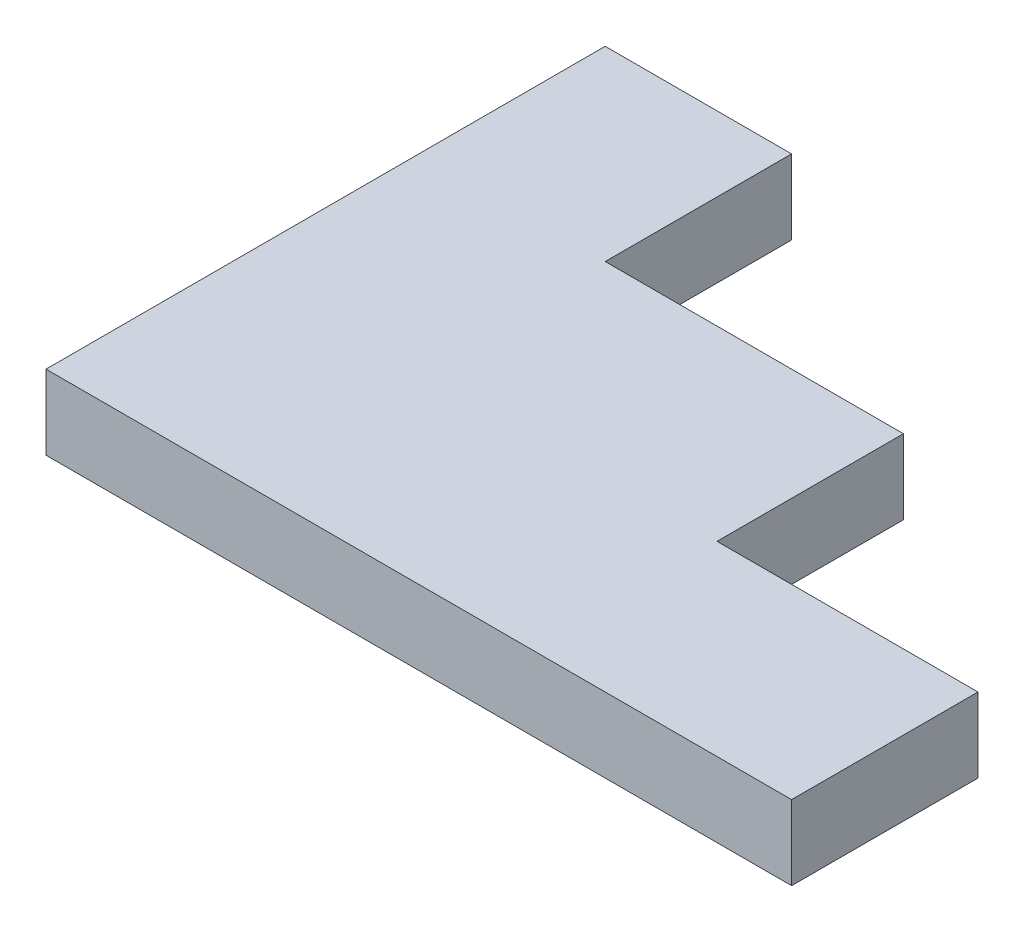
ISO-10303-21;
HEADER;
FILE_DESCRIPTION(('STEP AP214'),'2;1');
FILE_NAME('part.step','',(''),(''),'','','');
FILE_SCHEMA(('AUTOMOTIVE_DESIGN { 1 0 10303 214 1 1 1 1 }'));
ENDSEC;
DATA;
#1=APPLICATION_CONTEXT('core data for automotive mechanical design processes');
#2=APPLICATION_PROTOCOL_DEFINITION('international standard','automotive_design',2000,#1);
#3=PRODUCT_CONTEXT('',#1,'mechanical');
#4=PRODUCT('Part','Part','',(#3));
#5=PRODUCT_RELATED_PRODUCT_CATEGORY('part','',(#4));
#6=PRODUCT_DEFINITION_FORMATION('','',#4);
#7=PRODUCT_DEFINITION_CONTEXT('part definition',#1,'design');
#8=PRODUCT_DEFINITION('design','',#6,#7);
#9=PRODUCT_DEFINITION_SHAPE('','',#8);
#10=(LENGTH_UNIT() NAMED_UNIT(*) SI_UNIT(.MILLI.,.METRE.));
#11=(NAMED_UNIT(*) PLANE_ANGLE_UNIT() SI_UNIT($,.RADIAN.));
#12=(NAMED_UNIT(*) SI_UNIT($,.STERADIAN.) SOLID_ANGLE_UNIT());
#13=UNCERTAINTY_MEASURE_WITH_UNIT(LENGTH_MEASURE(1.E-05),#10,'distance_accuracy_value','');
#14=(GEOMETRIC_REPRESENTATION_CONTEXT(3) GLOBAL_UNCERTAINTY_ASSIGNED_CONTEXT((#13)) GLOBAL_UNIT_ASSIGNED_CONTEXT((#10,
#11,#12)) REPRESENTATION_CONTEXT('',''));
#15=CARTESIAN_POINT('',(0.,0.,0.));
#16=DIRECTION('',(0.,0.,1.));
#17=DIRECTION('',(1.,0.,0.));
#18=AXIS2_PLACEMENT_3D('',#15,#16,#17);
#19=CARTESIAN_POINT('',(0.,2.,0.));
#20=DIRECTION('',(0.,0.,-1.));
#21=DIRECTION('',(-1.,0.,0.));
#22=AXIS2_PLACEMENT_3D('',#19,#20,#21);
#23=PLANE('',#22);
#24=DIRECTION('',(1.,0.,0.));
#25=VECTOR('',#24,1.);
#26=CARTESIAN_POINT('',(0.,0.,0.));
#27=LINE('',#26,#25);
#28=CARTESIAN_POINT('',(0.,0.,0.));
#29=VERTEX_POINT('',#28);
#30=CARTESIAN_POINT('',(20.,0.,0.));
#31=VERTEX_POINT('',#30);
#32=EDGE_CURVE('E130',#29,#31,#27,.T.);
#33=ORIENTED_EDGE('',*,*,#32,.T.);
#34=DIRECTION('',(0.,-1.,0.));
#35=VECTOR('',#34,1.);
#36=CARTESIAN_POINT('',(20.,2.,0.));
#37=LINE('',#36,#35);
#38=CARTESIAN_POINT('',(20.,2.,0.));
#39=VERTEX_POINT('',#38);
#40=EDGE_CURVE('E11',#39,#31,#37,.T.);
#41=ORIENTED_EDGE('',*,*,#40,.F.);
#42=DIRECTION('',(1.,0.,0.));
#43=VECTOR('',#42,1.);
#44=CARTESIAN_POINT('',(0.,2.,0.));
#45=LINE('',#44,#43);
#46=CARTESIAN_POINT('',(0.,2.,0.));
#47=VERTEX_POINT('',#46);
#48=EDGE_CURVE('E150',#47,#39,#45,.T.);
#49=ORIENTED_EDGE('',*,*,#48,.F.);
#50=DIRECTION('',(0.,-1.,0.));
#51=VECTOR('',#50,1.);
#52=CARTESIAN_POINT('',(0.,2.,0.));
#53=LINE('',#52,#51);
#54=EDGE_CURVE('E49',#47,#29,#53,.T.);
#55=ORIENTED_EDGE('',*,*,#54,.T.);
#56=EDGE_LOOP('',(#33,#41,#49,#55));
#57=FACE_BOUND('',#56,.T.);
#58=ADVANCED_FACE('F33',(#57),#23,.F.);
#59=CARTESIAN_POINT('',(20.,2.,0.));
#60=DIRECTION('',(-1.,0.,0.));
#61=DIRECTION('',(0.,0.,1.));
#62=AXIS2_PLACEMENT_3D('',#59,#60,#61);
#63=PLANE('',#62);
#64=DIRECTION('',(0.,0.,-1.));
#65=VECTOR('',#64,1.);
#66=CARTESIAN_POINT('',(20.,0.,0.));
#67=LINE('',#66,#65);
#68=CARTESIAN_POINT('',(20.,0.,-5.));
#69=VERTEX_POINT('',#68);
#70=EDGE_CURVE('E132',#31,#69,#67,.T.);
#71=ORIENTED_EDGE('',*,*,#70,.T.);
#72=DIRECTION('',(0.,-1.,0.));
#73=VECTOR('',#72,1.);
#74=CARTESIAN_POINT('',(20.,2.,-5.));
#75=LINE('',#74,#73);
#76=CARTESIAN_POINT('',(20.,2.,-5.));
#77=VERTEX_POINT('',#76);
#78=EDGE_CURVE('E41',#77,#69,#75,.T.);
#79=ORIENTED_EDGE('',*,*,#78,.F.);
#80=DIRECTION('',(0.,0.,-1.));
#81=VECTOR('',#80,1.);
#82=CARTESIAN_POINT('',(20.,2.,0.));
#83=LINE('',#82,#81);
#84=EDGE_CURVE('E87',#39,#77,#83,.T.);
#85=ORIENTED_EDGE('',*,*,#84,.F.);
#86=ORIENTED_EDGE('',*,*,#40,.T.);
#87=EDGE_LOOP('',(#71,#79,#85,#86));
#88=FACE_BOUND('',#87,.T.);
#89=ADVANCED_FACE('F163',(#88),#63,.F.);
#90=CARTESIAN_POINT('',(13.,2.,-5.));
#91=DIRECTION('',(0.,0.,-1.));
#92=DIRECTION('',(-1.,0.,0.));
#93=AXIS2_PLACEMENT_3D('',#90,#91,#92);
#94=PLANE('',#93);
#95=DIRECTION('',(1.,0.,0.));
#96=VECTOR('',#95,1.);
#97=CARTESIAN_POINT('',(13.,0.,-5.));
#98=LINE('',#97,#96);
#99=CARTESIAN_POINT('',(13.,0.,-5.));
#100=VERTEX_POINT('',#99);
#101=EDGE_CURVE('E135',#100,#69,#98,.T.);
#102=ORIENTED_EDGE('',*,*,#101,.F.);
#103=DIRECTION('',(0.,-1.,0.));
#104=VECTOR('',#103,1.);
#105=CARTESIAN_POINT('',(13.,2.,-5.));
#106=LINE('',#105,#104);
#107=CARTESIAN_POINT('',(13.,2.,-5.));
#108=VERTEX_POINT('',#107);
#109=EDGE_CURVE('E156',#108,#100,#106,.T.);
#110=ORIENTED_EDGE('',*,*,#109,.F.);
#111=DIRECTION('',(1.,0.,0.));
#112=VECTOR('',#111,1.);
#113=CARTESIAN_POINT('',(13.,2.,-5.));
#114=LINE('',#113,#112);
#115=EDGE_CURVE('E162',#108,#77,#114,.T.);
#116=ORIENTED_EDGE('',*,*,#115,.T.);
#117=ORIENTED_EDGE('',*,*,#78,.T.);
#118=EDGE_LOOP('',(#102,#110,#116,#117));
#119=FACE_BOUND('',#118,.T.);
#120=ADVANCED_FACE('F160',(#119),#94,.T.);
#121=CARTESIAN_POINT('',(13.,2.,-10.));
#122=DIRECTION('',(1.,0.,0.));
#123=DIRECTION('',(0.,0.,-1.));
#124=AXIS2_PLACEMENT_3D('',#121,#122,#123);
#125=PLANE('',#124);
#126=DIRECTION('',(0.,0.,1.));
#127=VECTOR('',#126,1.);
#128=CARTESIAN_POINT('',(13.,0.,-10.));
#129=LINE('',#128,#127);
#130=CARTESIAN_POINT('',(13.,0.,-10.));
#131=VERTEX_POINT('',#130);
#132=EDGE_CURVE('E138',#131,#100,#129,.T.);
#133=ORIENTED_EDGE('',*,*,#132,.F.);
#134=DIRECTION('',(0.,-1.,0.));
#135=VECTOR('',#134,1.);
#136=CARTESIAN_POINT('',(13.,2.,-10.));
#137=LINE('',#136,#135);
#138=CARTESIAN_POINT('',(13.,2.,-10.));
#139=VERTEX_POINT('',#138);
#140=EDGE_CURVE('E154',#139,#131,#137,.T.);
#141=ORIENTED_EDGE('',*,*,#140,.F.);
#142=DIRECTION('',(0.,0.,1.));
#143=VECTOR('',#142,1.);
#144=CARTESIAN_POINT('',(13.,2.,-10.));
#145=LINE('',#144,#143);
#146=EDGE_CURVE('E172',#139,#108,#145,.T.);
#147=ORIENTED_EDGE('',*,*,#146,.T.);
#148=ORIENTED_EDGE('',*,*,#109,.T.);
#149=EDGE_LOOP('',(#133,#141,#147,#148));
#150=FACE_BOUND('',#149,.T.);
#151=ADVANCED_FACE('F170',(#150),#125,.T.);
#152=CARTESIAN_POINT('',(5.,2.,-10.));
#153=DIRECTION('',(0.,0.,-1.));
#154=DIRECTION('',(-1.,0.,0.));
#155=AXIS2_PLACEMENT_3D('',#152,#153,#154);
#156=PLANE('',#155);
#157=DIRECTION('',(1.,0.,0.));
#158=VECTOR('',#157,1.);
#159=CARTESIAN_POINT('',(5.,0.,-10.));
#160=LINE('',#159,#158);
#161=CARTESIAN_POINT('',(5.,0.,-10.));
#162=VERTEX_POINT('',#161);
#163=EDGE_CURVE('E141',#162,#131,#160,.T.);
#164=ORIENTED_EDGE('',*,*,#163,.F.);
#165=DIRECTION('',(0.,-1.,0.));
#166=VECTOR('',#165,1.);
#167=CARTESIAN_POINT('',(5.,2.,-10.));
#168=LINE('',#167,#166);
#169=CARTESIAN_POINT('',(5.,2.,-10.));
#170=VERTEX_POINT('',#169);
#171=EDGE_CURVE('E112',#170,#162,#168,.T.);
#172=ORIENTED_EDGE('',*,*,#171,.F.);
#173=DIRECTION('',(1.,0.,0.));
#174=VECTOR('',#173,1.);
#175=CARTESIAN_POINT('',(5.,2.,-10.));
#176=LINE('',#175,#174);
#177=EDGE_CURVE('E122',#170,#139,#176,.T.);
#178=ORIENTED_EDGE('',*,*,#177,.T.);
#179=ORIENTED_EDGE('',*,*,#140,.T.);
#180=EDGE_LOOP('',(#164,#172,#178,#179));
#181=FACE_BOUND('',#180,.T.);
#182=ADVANCED_FACE('F178',(#181),#156,.T.);
#183=CARTESIAN_POINT('',(5.,2.,-15.));
#184=DIRECTION('',(1.,0.,0.));
#185=DIRECTION('',(0.,0.,-1.));
#186=AXIS2_PLACEMENT_3D('',#183,#184,#185);
#187=PLANE('',#186);
#188=DIRECTION('',(0.,0.,1.));
#189=VECTOR('',#188,1.);
#190=CARTESIAN_POINT('',(5.,0.,-15.));
#191=LINE('',#190,#189);
#192=CARTESIAN_POINT('',(5.,0.,-15.));
#193=VERTEX_POINT('',#192);
#194=EDGE_CURVE('E108',#193,#162,#191,.T.);
#195=ORIENTED_EDGE('',*,*,#194,.F.);
#196=DIRECTION('',(0.,-1.,0.));
#197=VECTOR('',#196,1.);
#198=CARTESIAN_POINT('',(5.,2.,-15.));
#199=LINE('',#198,#197);
#200=CARTESIAN_POINT('',(5.,2.,-15.));
#201=VERTEX_POINT('',#200);
#202=EDGE_CURVE('E103',#201,#193,#199,.T.);
#203=ORIENTED_EDGE('',*,*,#202,.F.);
#204=DIRECTION('',(0.,0.,1.));
#205=VECTOR('',#204,1.);
#206=CARTESIAN_POINT('',(5.,2.,-15.));
#207=LINE('',#206,#205);
#208=EDGE_CURVE('E106',#201,#170,#207,.T.);
#209=ORIENTED_EDGE('',*,*,#208,.T.);
#210=ORIENTED_EDGE('',*,*,#171,.T.);
#211=EDGE_LOOP('',(#195,#203,#209,#210));
#212=FACE_BOUND('',#211,.T.);
#213=ADVANCED_FACE('F105',(#212),#187,.T.);
#214=CARTESIAN_POINT('',(0.,2.,-15.));
#215=DIRECTION('',(0.,0.,-1.));
#216=DIRECTION('',(-1.,0.,0.));
#217=AXIS2_PLACEMENT_3D('',#214,#215,#216);
#218=PLANE('',#217);
#219=DIRECTION('',(1.,0.,0.));
#220=VECTOR('',#219,1.);
#221=CARTESIAN_POINT('',(0.,0.,-15.));
#222=LINE('',#221,#220);
#223=CARTESIAN_POINT('',(0.,0.,-15.));
#224=VERTEX_POINT('',#223);
#225=EDGE_CURVE('E145',#224,#193,#222,.T.);
#226=ORIENTED_EDGE('',*,*,#225,.F.);
#227=DIRECTION('',(0.,-1.,0.));
#228=VECTOR('',#227,1.);
#229=CARTESIAN_POINT('',(0.,2.,-15.));
#230=LINE('',#229,#228);
#231=CARTESIAN_POINT('',(0.,2.,-15.));
#232=VERTEX_POINT('',#231);
#233=EDGE_CURVE('E75',#232,#224,#230,.T.);
#234=ORIENTED_EDGE('',*,*,#233,.F.);
#235=DIRECTION('',(1.,0.,0.));
#236=VECTOR('',#235,1.);
#237=CARTESIAN_POINT('',(0.,2.,-15.));
#238=LINE('',#237,#236);
#239=EDGE_CURVE('E119',#232,#201,#238,.T.);
#240=ORIENTED_EDGE('',*,*,#239,.T.);
#241=ORIENTED_EDGE('',*,*,#202,.T.);
#242=EDGE_LOOP('',(#226,#234,#240,#241));
#243=FACE_BOUND('',#242,.T.);
#244=ADVANCED_FACE('F124',(#243),#218,.T.);
#245=CARTESIAN_POINT('',(0.,2.,0.));
#246=DIRECTION('',(-1.,0.,0.));
#247=DIRECTION('',(0.,0.,1.));
#248=AXIS2_PLACEMENT_3D('',#245,#246,#247);
#249=PLANE('',#248);
#250=DIRECTION('',(0.,0.,-1.));
#251=VECTOR('',#250,1.);
#252=CARTESIAN_POINT('',(0.,0.,0.));
#253=LINE('',#252,#251);
#254=EDGE_CURVE('E147',#29,#224,#253,.T.);
#255=ORIENTED_EDGE('',*,*,#254,.F.);
#256=ORIENTED_EDGE('',*,*,#54,.F.);
#257=DIRECTION('',(0.,0.,-1.));
#258=VECTOR('',#257,1.);
#259=CARTESIAN_POINT('',(0.,2.,0.));
#260=LINE('',#259,#258);
#261=EDGE_CURVE('E125',#47,#232,#260,.T.);
#262=ORIENTED_EDGE('',*,*,#261,.T.);
#263=ORIENTED_EDGE('',*,*,#233,.T.);
#264=EDGE_LOOP('',(#255,#256,#262,#263));
#265=FACE_BOUND('',#264,.T.);
#266=ADVANCED_FACE('F179',(#265),#249,.T.);
#267=CARTESIAN_POINT('',(0.,2.,0.));
#268=DIRECTION('',(0.,1.,0.));
#269=DIRECTION('',(0.,0.,1.));
#270=AXIS2_PLACEMENT_3D('',#267,#268,#269);
#271=PLANE('',#270);
#272=ORIENTED_EDGE('',*,*,#48,.T.);
#273=ORIENTED_EDGE('',*,*,#84,.T.);
#274=ORIENTED_EDGE('',*,*,#115,.F.);
#275=ORIENTED_EDGE('',*,*,#146,.F.);
#276=ORIENTED_EDGE('',*,*,#177,.F.);
#277=ORIENTED_EDGE('',*,*,#208,.F.);
#278=ORIENTED_EDGE('',*,*,#239,.F.);
#279=ORIENTED_EDGE('',*,*,#261,.F.);
#280=EDGE_LOOP('',(#272,#273,#274,#275,#276,#277,#278,#279));
#281=FACE_BOUND('',#280,.T.);
#282=ADVANCED_FACE('F117',(#281),#271,.T.);
#283=CARTESIAN_POINT('',(0.,0.,0.));
#284=DIRECTION('',(0.,1.,0.));
#285=DIRECTION('',(0.,0.,1.));
#286=AXIS2_PLACEMENT_3D('',#283,#284,#285);
#287=PLANE('',#286);
#288=ORIENTED_EDGE('',*,*,#32,.F.);
#289=ORIENTED_EDGE('',*,*,#254,.T.);
#290=ORIENTED_EDGE('',*,*,#225,.T.);
#291=ORIENTED_EDGE('',*,*,#194,.T.);
#292=ORIENTED_EDGE('',*,*,#163,.T.);
#293=ORIENTED_EDGE('',*,*,#132,.T.);
#294=ORIENTED_EDGE('',*,*,#101,.T.);
#295=ORIENTED_EDGE('',*,*,#70,.F.);
#296=EDGE_LOOP('',(#288,#289,#290,#291,#292,#293,#294,#295));
#297=FACE_BOUND('',#296,.T.);
#298=ADVANCED_FACE('F166',(#297),#287,.F.);
#299=CLOSED_SHELL('',(#58,#89,#120,#151,#182,#213,#244,#266,#282,#298));
#300=MANIFOLD_SOLID_BREP('B2',#299);
#301=ADVANCED_BREP_SHAPE_REPRESENTATION('',(#18,#300),#14);
#302=SHAPE_DEFINITION_REPRESENTATION(#9,#301);
ENDSEC;
END-ISO-10303-21;
